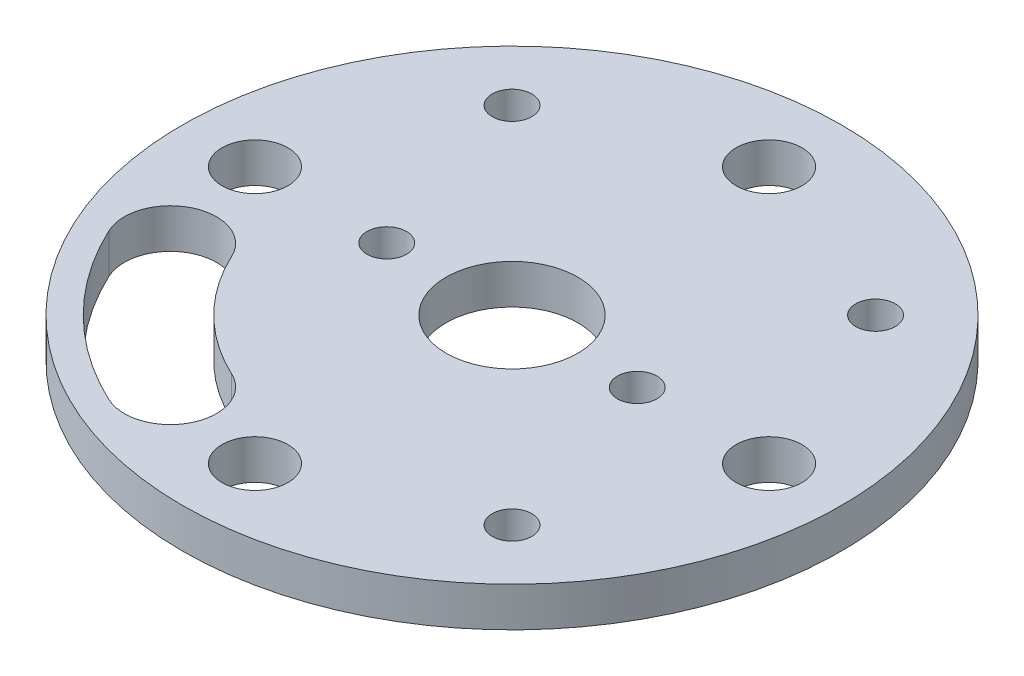
ISO-10303-21;
HEADER;
FILE_DESCRIPTION(('STEP AP214'),'2;1');
FILE_NAME('part.step','',(''),(''),'','','');
FILE_SCHEMA(('AUTOMOTIVE_DESIGN { 1 0 10303 214 1 1 1 1 }'));
ENDSEC;
DATA;
#1=APPLICATION_CONTEXT('core data for automotive mechanical design processes');
#2=APPLICATION_PROTOCOL_DEFINITION('international standard','automotive_design',2000,#1);
#3=PRODUCT_CONTEXT('',#1,'mechanical');
#4=PRODUCT('Part','Part','',(#3));
#5=PRODUCT_RELATED_PRODUCT_CATEGORY('part','',(#4));
#6=PRODUCT_DEFINITION_FORMATION('','',#4);
#7=PRODUCT_DEFINITION_CONTEXT('part definition',#1,'design');
#8=PRODUCT_DEFINITION('design','',#6,#7);
#9=PRODUCT_DEFINITION_SHAPE('','',#8);
#10=(LENGTH_UNIT() NAMED_UNIT(*) SI_UNIT(.MILLI.,.METRE.));
#11=(NAMED_UNIT(*) PLANE_ANGLE_UNIT() SI_UNIT($,.RADIAN.));
#12=(NAMED_UNIT(*) SI_UNIT($,.STERADIAN.) SOLID_ANGLE_UNIT());
#13=UNCERTAINTY_MEASURE_WITH_UNIT(LENGTH_MEASURE(1.E-05),#10,'distance_accuracy_value','');
#14=(GEOMETRIC_REPRESENTATION_CONTEXT(3) GLOBAL_UNCERTAINTY_ASSIGNED_CONTEXT((#13)) GLOBAL_UNIT_ASSIGNED_CONTEXT((#10,
#11,#12)) REPRESENTATION_CONTEXT('',''));
#15=CARTESIAN_POINT('',(0.,0.,0.));
#16=DIRECTION('',(0.,0.,1.));
#17=DIRECTION('',(1.,0.,0.));
#18=AXIS2_PLACEMENT_3D('',#15,#16,#17);
#19=CARTESIAN_POINT('',(0.,3.,0.));
#20=DIRECTION('',(0.,1.,0.));
#21=DIRECTION('',(0.,0.,1.));
#22=AXIS2_PLACEMENT_3D('',#19,#20,#21);
#23=PLANE('',#22);
#24=CARTESIAN_POINT('',(13.7885822331377,3.,-13.7885822331377));
#25=DIRECTION('',(0.,1.,0.));
#26=DIRECTION('',(0.,0.,1.));
#27=AXIS2_PLACEMENT_3D('',#24,#25,#26);
#28=CIRCLE('',#27,1.5);
#29=CARTESIAN_POINT('',(13.7885822331377,3.,-12.2885822331377));
#30=VERTEX_POINT('',#29);
#31=EDGE_CURVE('E179',#30,#30,#28,.T.);
#32=ORIENTED_EDGE('',*,*,#31,.F.);
#33=EDGE_LOOP('',(#32));
#34=FACE_BOUND('',#33,.T.);
#35=CARTESIAN_POINT('',(0.,3.,0.));
#36=DIRECTION('',(0.,1.,0.));
#37=DIRECTION('',(0.,0.,1.));
#38=AXIS2_PLACEMENT_3D('',#35,#36,#37);
#39=CIRCLE('',#38,23.);
#40=CARTESIAN_POINT('',(-20.8450791018429,3.,9.72022002003619));
#41=VERTEX_POINT('',#40);
#42=CARTESIAN_POINT('',(-9.72022002003597,3.,20.845079101843));
#43=VERTEX_POINT('',#42);
#44=EDGE_CURVE('E81',#41,#43,#39,.T.);
#45=ORIENTED_EDGE('',*,*,#44,.F.);
#46=CARTESIAN_POINT('',(-17.6730018472146,3.,8.24105610394372));
#47=DIRECTION('',(0.,1.,0.));
#48=DIRECTION('',(0.,0.,-1.));
#49=AXIS2_PLACEMENT_3D('',#46,#47,#48);
#50=CIRCLE('',#49,3.50000000000001);
#51=CARTESIAN_POINT('',(-14.5009245925864,3.,6.76189218785126));
#52=VERTEX_POINT('',#51);
#53=EDGE_CURVE('E73',#52,#41,#50,.T.);
#54=ORIENTED_EDGE('',*,*,#53,.F.);
#55=CARTESIAN_POINT('',(0.,3.,0.));
#56=DIRECTION('',(0.,-1.,0.));
#57=DIRECTION('',(0.,0.,1.));
#58=AXIS2_PLACEMENT_3D('',#55,#56,#57);
#59=CIRCLE('',#58,16.);
#60=CARTESIAN_POINT('',(-6.76189218785111,3.,14.5009245925864));
#61=VERTEX_POINT('',#60);
#62=EDGE_CURVE('E96',#61,#52,#59,.T.);
#63=ORIENTED_EDGE('',*,*,#62,.F.);
#64=CARTESIAN_POINT('',(-8.24105610394353,3.,17.6730018472147));
#65=DIRECTION('',(0.,1.,0.));
#66=DIRECTION('',(0.,0.,-1.));
#67=AXIS2_PLACEMENT_3D('',#64,#65,#66);
#68=CIRCLE('',#67,3.50000000000001);
#69=EDGE_CURVE('E94',#43,#61,#68,.T.);
#70=ORIENTED_EDGE('',*,*,#69,.F.);
#71=EDGE_LOOP('',(#45,#54,#63,#70));
#72=FACE_BOUND('',#71,.T.);
#73=CARTESIAN_POINT('',(0.,3.,19.5));
#74=DIRECTION('',(0.,1.,0.));
#75=DIRECTION('',(0.,0.,1.));
#76=AXIS2_PLACEMENT_3D('',#73,#74,#75);
#77=CIRCLE('',#76,2.5);
#78=CARTESIAN_POINT('',(0.,3.,22.));
#79=VERTEX_POINT('',#78);
#80=EDGE_CURVE('E118',#79,#79,#77,.T.);
#81=ORIENTED_EDGE('',*,*,#80,.F.);
#82=EDGE_LOOP('',(#81));
#83=FACE_BOUND('',#82,.T.);
#84=CARTESIAN_POINT('',(0.,3.,-19.5));
#85=DIRECTION('',(0.,1.,0.));
#86=DIRECTION('',(0.,0.,1.));
#87=AXIS2_PLACEMENT_3D('',#84,#85,#86);
#88=CIRCLE('',#87,2.5);
#89=CARTESIAN_POINT('',(0.,3.,-17.));
#90=VERTEX_POINT('',#89);
#91=EDGE_CURVE('E130',#90,#90,#88,.T.);
#92=ORIENTED_EDGE('',*,*,#91,.F.);
#93=EDGE_LOOP('',(#92));
#94=FACE_BOUND('',#93,.T.);
#95=CARTESIAN_POINT('',(-9.5,3.,0.));
#96=DIRECTION('',(0.,1.,0.));
#97=DIRECTION('',(0.,0.,1.));
#98=AXIS2_PLACEMENT_3D('',#95,#96,#97);
#99=CIRCLE('',#98,1.5);
#100=CARTESIAN_POINT('',(-9.5,3.,1.5));
#101=VERTEX_POINT('',#100);
#102=EDGE_CURVE('E142',#101,#101,#99,.T.);
#103=ORIENTED_EDGE('',*,*,#102,.F.);
#104=EDGE_LOOP('',(#103));
#105=FACE_BOUND('',#104,.T.);
#106=CARTESIAN_POINT('',(0.,3.,0.));
#107=DIRECTION('',(0.,1.,0.));
#108=DIRECTION('',(0.,0.,1.));
#109=AXIS2_PLACEMENT_3D('',#106,#107,#108);
#110=CIRCLE('',#109,25.);
#111=CARTESIAN_POINT('',(0.,3.,25.));
#112=VERTEX_POINT('',#111);
#113=EDGE_CURVE('E11',#112,#112,#110,.T.);
#114=ORIENTED_EDGE('',*,*,#113,.T.);
#115=EDGE_LOOP('',(#114));
#116=FACE_BOUND('',#115,.T.);
#117=CARTESIAN_POINT('',(0.,3.,0.));
#118=DIRECTION('',(0.,1.,0.));
#119=DIRECTION('',(0.,0.,1.));
#120=AXIS2_PLACEMENT_3D('',#117,#118,#119);
#121=CIRCLE('',#120,5.);
#122=CARTESIAN_POINT('',(0.,3.,5.));
#123=VERTEX_POINT('',#122);
#124=EDGE_CURVE('E148',#123,#123,#121,.T.);
#125=ORIENTED_EDGE('',*,*,#124,.F.);
#126=EDGE_LOOP('',(#125));
#127=FACE_BOUND('',#126,.T.);
#128=CARTESIAN_POINT('',(9.5,3.,0.));
#129=DIRECTION('',(0.,1.,0.));
#130=DIRECTION('',(0.,0.,1.));
#131=AXIS2_PLACEMENT_3D('',#128,#129,#130);
#132=CIRCLE('',#131,1.5);
#133=CARTESIAN_POINT('',(9.5,3.,1.5));
#134=VERTEX_POINT('',#133);
#135=EDGE_CURVE('E136',#134,#134,#132,.T.);
#136=ORIENTED_EDGE('',*,*,#135,.F.);
#137=EDGE_LOOP('',(#136));
#138=FACE_BOUND('',#137,.T.);
#139=CARTESIAN_POINT('',(19.5,3.,0.));
#140=DIRECTION('',(0.,1.,0.));
#141=DIRECTION('',(0.,0.,1.));
#142=AXIS2_PLACEMENT_3D('',#139,#140,#141);
#143=CIRCLE('',#142,2.5);
#144=CARTESIAN_POINT('',(19.5,3.,2.5));
#145=VERTEX_POINT('',#144);
#146=EDGE_CURVE('E124',#145,#145,#143,.T.);
#147=ORIENTED_EDGE('',*,*,#146,.F.);
#148=EDGE_LOOP('',(#147));
#149=FACE_BOUND('',#148,.T.);
#150=CARTESIAN_POINT('',(-19.5,3.,0.));
#151=DIRECTION('',(0.,1.,0.));
#152=DIRECTION('',(0.,0.,1.));
#153=AXIS2_PLACEMENT_3D('',#150,#151,#152);
#154=CIRCLE('',#153,2.5);
#155=CARTESIAN_POINT('',(-19.5,3.,2.5));
#156=VERTEX_POINT('',#155);
#157=EDGE_CURVE('E112',#156,#156,#154,.T.);
#158=ORIENTED_EDGE('',*,*,#157,.F.);
#159=EDGE_LOOP('',(#158));
#160=FACE_BOUND('',#159,.T.);
#161=CARTESIAN_POINT('',(-13.7885822331377,3.,-13.7885822331376));
#162=DIRECTION('',(0.,1.,0.));
#163=DIRECTION('',(0.,0.,1.));
#164=AXIS2_PLACEMENT_3D('',#161,#162,#163);
#165=CIRCLE('',#164,1.5);
#166=CARTESIAN_POINT('',(-13.7885822331377,3.,-12.2885822331376));
#167=VERTEX_POINT('',#166);
#168=EDGE_CURVE('E102',#167,#167,#165,.T.);
#169=ORIENTED_EDGE('',*,*,#168,.F.);
#170=EDGE_LOOP('',(#169));
#171=FACE_BOUND('',#170,.T.);
#172=CARTESIAN_POINT('',(13.7885822331377,3.,13.7885822331377));
#173=DIRECTION('',(0.,1.,0.));
#174=DIRECTION('',(0.,0.,1.));
#175=AXIS2_PLACEMENT_3D('',#172,#173,#174);
#176=CIRCLE('',#175,1.5);
#177=CARTESIAN_POINT('',(13.7885822331377,3.,15.2885822331377));
#178=VERTEX_POINT('',#177);
#179=EDGE_CURVE('E186',#178,#178,#176,.T.);
#180=ORIENTED_EDGE('',*,*,#179,.F.);
#181=EDGE_LOOP('',(#180));
#182=FACE_BOUND('',#181,.T.);
#183=ADVANCED_FACE('F32',(#34,#72,#83,#94,#105,#116,#127,#138,#149,#160,#171,#182),#23,.T.);
#184=CARTESIAN_POINT('',(0.,0.,0.));
#185=DIRECTION('',(0.,1.,0.));
#186=DIRECTION('',(0.,0.,1.));
#187=AXIS2_PLACEMENT_3D('',#184,#185,#186);
#188=PLANE('',#187);
#189=CARTESIAN_POINT('',(13.7885822331377,0.,-13.7885822331377));
#190=DIRECTION('',(0.,1.,0.));
#191=DIRECTION('',(0.,0.,1.));
#192=AXIS2_PLACEMENT_3D('',#189,#190,#191);
#193=CIRCLE('',#192,1.5);
#194=CARTESIAN_POINT('',(13.7885822331377,0.,-12.2885822331377));
#195=VERTEX_POINT('',#194);
#196=EDGE_CURVE('E182',#195,#195,#193,.T.);
#197=ORIENTED_EDGE('',*,*,#196,.T.);
#198=EDGE_LOOP('',(#197));
#199=FACE_BOUND('',#198,.T.);
#200=CARTESIAN_POINT('',(-17.6730018472146,0.,8.24105610394372));
#201=DIRECTION('',(0.,1.,0.));
#202=DIRECTION('',(0.,0.,-1.));
#203=AXIS2_PLACEMENT_3D('',#200,#201,#202);
#204=CIRCLE('',#203,3.50000000000001);
#205=CARTESIAN_POINT('',(-14.5009245925864,0.,6.76189218785126));
#206=VERTEX_POINT('',#205);
#207=CARTESIAN_POINT('',(-20.8450791018429,0.,9.72022002003619));
#208=VERTEX_POINT('',#207);
#209=EDGE_CURVE('E55',#206,#208,#204,.T.);
#210=ORIENTED_EDGE('',*,*,#209,.T.);
#211=CARTESIAN_POINT('',(0.,0.,0.));
#212=DIRECTION('',(0.,1.,0.));
#213=DIRECTION('',(0.,0.,1.));
#214=AXIS2_PLACEMENT_3D('',#211,#212,#213);
#215=CIRCLE('',#214,23.);
#216=CARTESIAN_POINT('',(-9.72022002003597,0.,20.845079101843));
#217=VERTEX_POINT('',#216);
#218=EDGE_CURVE('E88',#208,#217,#215,.T.);
#219=ORIENTED_EDGE('',*,*,#218,.T.);
#220=CARTESIAN_POINT('',(-8.24105610394353,0.,17.6730018472147));
#221=DIRECTION('',(0.,1.,0.));
#222=DIRECTION('',(0.,0.,-1.));
#223=AXIS2_PLACEMENT_3D('',#220,#221,#222);
#224=CIRCLE('',#223,3.50000000000001);
#225=CARTESIAN_POINT('',(-6.76189218785111,0.,14.5009245925864));
#226=VERTEX_POINT('',#225);
#227=EDGE_CURVE('E104',#217,#226,#224,.T.);
#228=ORIENTED_EDGE('',*,*,#227,.T.);
#229=CARTESIAN_POINT('',(0.,0.,0.));
#230=DIRECTION('',(0.,-1.,0.));
#231=DIRECTION('',(0.,0.,1.));
#232=AXIS2_PLACEMENT_3D('',#229,#230,#231);
#233=CIRCLE('',#232,16.);
#234=EDGE_CURVE('E82',#226,#206,#233,.T.);
#235=ORIENTED_EDGE('',*,*,#234,.T.);
#236=EDGE_LOOP('',(#210,#219,#228,#235));
#237=FACE_BOUND('',#236,.T.);
#238=CARTESIAN_POINT('',(0.,0.,19.5));
#239=DIRECTION('',(0.,1.,0.));
#240=DIRECTION('',(0.,0.,1.));
#241=AXIS2_PLACEMENT_3D('',#238,#239,#240);
#242=CIRCLE('',#241,2.5);
#243=CARTESIAN_POINT('',(0.,0.,22.));
#244=VERTEX_POINT('',#243);
#245=EDGE_CURVE('E115',#244,#244,#242,.T.);
#246=ORIENTED_EDGE('',*,*,#245,.T.);
#247=EDGE_LOOP('',(#246));
#248=FACE_BOUND('',#247,.T.);
#249=CARTESIAN_POINT('',(0.,0.,-19.5));
#250=DIRECTION('',(0.,1.,0.));
#251=DIRECTION('',(0.,0.,1.));
#252=AXIS2_PLACEMENT_3D('',#249,#250,#251);
#253=CIRCLE('',#252,2.5);
#254=CARTESIAN_POINT('',(0.,0.,-17.));
#255=VERTEX_POINT('',#254);
#256=EDGE_CURVE('E127',#255,#255,#253,.T.);
#257=ORIENTED_EDGE('',*,*,#256,.T.);
#258=EDGE_LOOP('',(#257));
#259=FACE_BOUND('',#258,.T.);
#260=CARTESIAN_POINT('',(-9.5,0.,0.));
#261=DIRECTION('',(0.,1.,0.));
#262=DIRECTION('',(0.,0.,1.));
#263=AXIS2_PLACEMENT_3D('',#260,#261,#262);
#264=CIRCLE('',#263,1.5);
#265=CARTESIAN_POINT('',(-9.5,0.,1.5));
#266=VERTEX_POINT('',#265);
#267=EDGE_CURVE('E139',#266,#266,#264,.T.);
#268=ORIENTED_EDGE('',*,*,#267,.T.);
#269=EDGE_LOOP('',(#268));
#270=FACE_BOUND('',#269,.T.);
#271=CARTESIAN_POINT('',(0.,0.,0.));
#272=DIRECTION('',(0.,1.,0.));
#273=DIRECTION('',(0.,0.,1.));
#274=AXIS2_PLACEMENT_3D('',#271,#272,#273);
#275=CIRCLE('',#274,25.);
#276=CARTESIAN_POINT('',(0.,0.,25.));
#277=VERTEX_POINT('',#276);
#278=EDGE_CURVE('E36',#277,#277,#275,.T.);
#279=ORIENTED_EDGE('',*,*,#278,.F.);
#280=EDGE_LOOP('',(#279));
#281=FACE_BOUND('',#280,.T.);
#282=CARTESIAN_POINT('',(0.,0.,0.));
#283=DIRECTION('',(0.,1.,0.));
#284=DIRECTION('',(0.,0.,1.));
#285=AXIS2_PLACEMENT_3D('',#282,#283,#284);
#286=CIRCLE('',#285,5.);
#287=CARTESIAN_POINT('',(0.,0.,5.));
#288=VERTEX_POINT('',#287);
#289=EDGE_CURVE('E145',#288,#288,#286,.T.);
#290=ORIENTED_EDGE('',*,*,#289,.T.);
#291=EDGE_LOOP('',(#290));
#292=FACE_BOUND('',#291,.T.);
#293=CARTESIAN_POINT('',(9.5,0.,0.));
#294=DIRECTION('',(0.,1.,0.));
#295=DIRECTION('',(0.,0.,1.));
#296=AXIS2_PLACEMENT_3D('',#293,#294,#295);
#297=CIRCLE('',#296,1.5);
#298=CARTESIAN_POINT('',(9.5,0.,1.5));
#299=VERTEX_POINT('',#298);
#300=EDGE_CURVE('E133',#299,#299,#297,.T.);
#301=ORIENTED_EDGE('',*,*,#300,.T.);
#302=EDGE_LOOP('',(#301));
#303=FACE_BOUND('',#302,.T.);
#304=CARTESIAN_POINT('',(19.5,0.,0.));
#305=DIRECTION('',(0.,1.,0.));
#306=DIRECTION('',(0.,0.,1.));
#307=AXIS2_PLACEMENT_3D('',#304,#305,#306);
#308=CIRCLE('',#307,2.5);
#309=CARTESIAN_POINT('',(19.5,0.,2.5));
#310=VERTEX_POINT('',#309);
#311=EDGE_CURVE('E121',#310,#310,#308,.T.);
#312=ORIENTED_EDGE('',*,*,#311,.T.);
#313=EDGE_LOOP('',(#312));
#314=FACE_BOUND('',#313,.T.);
#315=CARTESIAN_POINT('',(-19.5,0.,0.));
#316=DIRECTION('',(0.,1.,0.));
#317=DIRECTION('',(0.,0.,1.));
#318=AXIS2_PLACEMENT_3D('',#315,#316,#317);
#319=CIRCLE('',#318,2.5);
#320=CARTESIAN_POINT('',(-19.5,0.,2.5));
#321=VERTEX_POINT('',#320);
#322=EDGE_CURVE('E89',#321,#321,#319,.T.);
#323=ORIENTED_EDGE('',*,*,#322,.T.);
#324=EDGE_LOOP('',(#323));
#325=FACE_BOUND('',#324,.T.);
#326=CARTESIAN_POINT('',(-13.7885822331377,0.,-13.7885822331376));
#327=DIRECTION('',(0.,1.,0.));
#328=DIRECTION('',(0.,0.,1.));
#329=AXIS2_PLACEMENT_3D('',#326,#327,#328);
#330=CIRCLE('',#329,1.5);
#331=CARTESIAN_POINT('',(-13.7885822331377,0.,-12.2885822331376));
#332=VERTEX_POINT('',#331);
#333=EDGE_CURVE('E181',#332,#332,#330,.T.);
#334=ORIENTED_EDGE('',*,*,#333,.T.);
#335=EDGE_LOOP('',(#334));
#336=FACE_BOUND('',#335,.T.);
#337=CARTESIAN_POINT('',(13.7885822331377,0.,13.7885822331377));
#338=DIRECTION('',(0.,1.,0.));
#339=DIRECTION('',(0.,0.,1.));
#340=AXIS2_PLACEMENT_3D('',#337,#338,#339);
#341=CIRCLE('',#340,1.5);
#342=CARTESIAN_POINT('',(13.7885822331377,0.,15.2885822331377));
#343=VERTEX_POINT('',#342);
#344=EDGE_CURVE('E189',#343,#343,#341,.T.);
#345=ORIENTED_EDGE('',*,*,#344,.T.);
#346=EDGE_LOOP('',(#345));
#347=FACE_BOUND('',#346,.T.);
#348=ADVANCED_FACE('F154',(#199,#237,#248,#259,#270,#281,#292,#303,#314,#325,#336,#347),#188,.F.);
#349=CARTESIAN_POINT('',(0.,3.,0.));
#350=DIRECTION('',(0.,-1.,0.));
#351=DIRECTION('',(0.,0.,-1.));
#352=AXIS2_PLACEMENT_3D('',#349,#350,#351);
#353=CYLINDRICAL_SURFACE('',#352,25.);
#354=ORIENTED_EDGE('',*,*,#113,.F.);
#355=EDGE_LOOP('',(#354));
#356=FACE_BOUND('',#355,.T.);
#357=ORIENTED_EDGE('',*,*,#278,.T.);
#358=EDGE_LOOP('',(#357));
#359=FACE_BOUND('',#358,.T.);
#360=ADVANCED_FACE('F34',(#356,#359),#353,.T.);
#361=CARTESIAN_POINT('',(0.,3.,0.));
#362=DIRECTION('',(0.,-1.,0.));
#363=DIRECTION('',(0.,0.,-1.));
#364=AXIS2_PLACEMENT_3D('',#361,#362,#363);
#365=CYLINDRICAL_SURFACE('',#364,5.);
#366=ORIENTED_EDGE('',*,*,#124,.T.);
#367=EDGE_LOOP('',(#366));
#368=FACE_BOUND('',#367,.T.);
#369=ORIENTED_EDGE('',*,*,#289,.F.);
#370=EDGE_LOOP('',(#369));
#371=FACE_BOUND('',#370,.T.);
#372=ADVANCED_FACE('F157',(#368,#371),#365,.F.);
#373=CARTESIAN_POINT('',(-9.5,3.,0.));
#374=DIRECTION('',(0.,-1.,0.));
#375=DIRECTION('',(0.,0.,-1.));
#376=AXIS2_PLACEMENT_3D('',#373,#374,#375);
#377=CYLINDRICAL_SURFACE('',#376,1.5);
#378=ORIENTED_EDGE('',*,*,#102,.T.);
#379=EDGE_LOOP('',(#378));
#380=FACE_BOUND('',#379,.T.);
#381=ORIENTED_EDGE('',*,*,#267,.F.);
#382=EDGE_LOOP('',(#381));
#383=FACE_BOUND('',#382,.T.);
#384=ADVANCED_FACE('F159',(#380,#383),#377,.F.);
#385=CARTESIAN_POINT('',(9.5,3.,0.));
#386=DIRECTION('',(0.,-1.,0.));
#387=DIRECTION('',(0.,0.,-1.));
#388=AXIS2_PLACEMENT_3D('',#385,#386,#387);
#389=CYLINDRICAL_SURFACE('',#388,1.5);
#390=ORIENTED_EDGE('',*,*,#135,.T.);
#391=EDGE_LOOP('',(#390));
#392=FACE_BOUND('',#391,.T.);
#393=ORIENTED_EDGE('',*,*,#300,.F.);
#394=EDGE_LOOP('',(#393));
#395=FACE_BOUND('',#394,.T.);
#396=ADVANCED_FACE('F166',(#392,#395),#389,.F.);
#397=CARTESIAN_POINT('',(0.,3.,-19.5));
#398=DIRECTION('',(0.,-1.,0.));
#399=DIRECTION('',(0.,0.,-1.));
#400=AXIS2_PLACEMENT_3D('',#397,#398,#399);
#401=CYLINDRICAL_SURFACE('',#400,2.5);
#402=ORIENTED_EDGE('',*,*,#91,.T.);
#403=EDGE_LOOP('',(#402));
#404=FACE_BOUND('',#403,.T.);
#405=ORIENTED_EDGE('',*,*,#256,.F.);
#406=EDGE_LOOP('',(#405));
#407=FACE_BOUND('',#406,.T.);
#408=ADVANCED_FACE('F239',(#404,#407),#401,.F.);
#409=CARTESIAN_POINT('',(19.5,3.,0.));
#410=DIRECTION('',(0.,-1.,0.));
#411=DIRECTION('',(0.,0.,-1.));
#412=AXIS2_PLACEMENT_3D('',#409,#410,#411);
#413=CYLINDRICAL_SURFACE('',#412,2.5);
#414=ORIENTED_EDGE('',*,*,#146,.T.);
#415=EDGE_LOOP('',(#414));
#416=FACE_BOUND('',#415,.T.);
#417=ORIENTED_EDGE('',*,*,#311,.F.);
#418=EDGE_LOOP('',(#417));
#419=FACE_BOUND('',#418,.T.);
#420=ADVANCED_FACE('F235',(#416,#419),#413,.F.);
#421=CARTESIAN_POINT('',(0.,3.,19.5));
#422=DIRECTION('',(0.,-1.,0.));
#423=DIRECTION('',(0.,0.,-1.));
#424=AXIS2_PLACEMENT_3D('',#421,#422,#423);
#425=CYLINDRICAL_SURFACE('',#424,2.5);
#426=ORIENTED_EDGE('',*,*,#80,.T.);
#427=EDGE_LOOP('',(#426));
#428=FACE_BOUND('',#427,.T.);
#429=ORIENTED_EDGE('',*,*,#245,.F.);
#430=EDGE_LOOP('',(#429));
#431=FACE_BOUND('',#430,.T.);
#432=ADVANCED_FACE('F231',(#428,#431),#425,.F.);
#433=CARTESIAN_POINT('',(-19.5,3.,0.));
#434=DIRECTION('',(0.,-1.,0.));
#435=DIRECTION('',(0.,0.,-1.));
#436=AXIS2_PLACEMENT_3D('',#433,#434,#435);
#437=CYLINDRICAL_SURFACE('',#436,2.5);
#438=ORIENTED_EDGE('',*,*,#157,.T.);
#439=EDGE_LOOP('',(#438));
#440=FACE_BOUND('',#439,.T.);
#441=ORIENTED_EDGE('',*,*,#322,.F.);
#442=EDGE_LOOP('',(#441));
#443=FACE_BOUND('',#442,.T.);
#444=ADVANCED_FACE('F228',(#440,#443),#437,.F.);
#445=CARTESIAN_POINT('',(-17.6730018472146,3.,8.24105610394372));
#446=DIRECTION('',(0.,-1.,0.));
#447=DIRECTION('',(0.,0.,-1.));
#448=AXIS2_PLACEMENT_3D('',#445,#446,#447);
#449=CYLINDRICAL_SURFACE('',#448,3.50000000000001);
#450=ORIENTED_EDGE('',*,*,#209,.F.);
#451=DIRECTION('',(0.,-1.,0.));
#452=VECTOR('',#451,1.);
#453=CARTESIAN_POINT('',(-14.5009245925864,3.,6.76189218785126));
#454=LINE('',#453,#452);
#455=EDGE_CURVE('E77',#52,#206,#454,.T.);
#456=ORIENTED_EDGE('',*,*,#455,.F.);
#457=ORIENTED_EDGE('',*,*,#53,.T.);
#458=DIRECTION('',(0.,-1.,0.));
#459=VECTOR('',#458,1.);
#460=CARTESIAN_POINT('',(-20.8450791018429,3.,9.72022002003619));
#461=LINE('',#460,#459);
#462=EDGE_CURVE('E76',#41,#208,#461,.T.);
#463=ORIENTED_EDGE('',*,*,#462,.T.);
#464=EDGE_LOOP('',(#450,#456,#457,#463));
#465=FACE_BOUND('',#464,.T.);
#466=ADVANCED_FACE('F75',(#465),#449,.F.);
#467=CARTESIAN_POINT('',(0.,3.,0.));
#468=DIRECTION('',(0.,-1.,0.));
#469=DIRECTION('',(0.,0.,-1.));
#470=AXIS2_PLACEMENT_3D('',#467,#468,#469);
#471=CYLINDRICAL_SURFACE('',#470,23.);
#472=ORIENTED_EDGE('',*,*,#218,.F.);
#473=ORIENTED_EDGE('',*,*,#462,.F.);
#474=ORIENTED_EDGE('',*,*,#44,.T.);
#475=DIRECTION('',(0.,-1.,0.));
#476=VECTOR('',#475,1.);
#477=CARTESIAN_POINT('',(-9.72022002003597,3.,20.845079101843));
#478=LINE('',#477,#476);
#479=EDGE_CURVE('E90',#43,#217,#478,.T.);
#480=ORIENTED_EDGE('',*,*,#479,.T.);
#481=EDGE_LOOP('',(#472,#473,#474,#480));
#482=FACE_BOUND('',#481,.T.);
#483=ADVANCED_FACE('F85',(#482),#471,.F.);
#484=CARTESIAN_POINT('',(-8.24105610394353,3.,17.6730018472147));
#485=DIRECTION('',(0.,-1.,0.));
#486=DIRECTION('',(0.,0.,-1.));
#487=AXIS2_PLACEMENT_3D('',#484,#485,#486);
#488=CYLINDRICAL_SURFACE('',#487,3.50000000000001);
#489=ORIENTED_EDGE('',*,*,#227,.F.);
#490=ORIENTED_EDGE('',*,*,#479,.F.);
#491=ORIENTED_EDGE('',*,*,#69,.T.);
#492=DIRECTION('',(0.,-1.,0.));
#493=VECTOR('',#492,1.);
#494=CARTESIAN_POINT('',(-6.76189218785111,3.,14.5009245925864));
#495=LINE('',#494,#493);
#496=EDGE_CURVE('E47',#61,#226,#495,.T.);
#497=ORIENTED_EDGE('',*,*,#496,.T.);
#498=EDGE_LOOP('',(#489,#490,#491,#497));
#499=FACE_BOUND('',#498,.T.);
#500=ADVANCED_FACE('F220',(#499),#488,.F.);
#501=CARTESIAN_POINT('',(0.,3.,0.));
#502=DIRECTION('',(0.,-1.,0.));
#503=DIRECTION('',(0.,0.,-1.));
#504=AXIS2_PLACEMENT_3D('',#501,#502,#503);
#505=CYLINDRICAL_SURFACE('',#504,16.);
#506=ORIENTED_EDGE('',*,*,#234,.F.);
#507=ORIENTED_EDGE('',*,*,#496,.F.);
#508=ORIENTED_EDGE('',*,*,#62,.T.);
#509=ORIENTED_EDGE('',*,*,#455,.T.);
#510=EDGE_LOOP('',(#506,#507,#508,#509));
#511=FACE_BOUND('',#510,.T.);
#512=ADVANCED_FACE('F217',(#511),#505,.T.);
#513=CARTESIAN_POINT('',(-13.7885822331377,3.,-13.7885822331376));
#514=DIRECTION('',(0.,-1.,0.));
#515=DIRECTION('',(0.,0.,-1.));
#516=AXIS2_PLACEMENT_3D('',#513,#514,#515);
#517=CYLINDRICAL_SURFACE('',#516,1.5);
#518=ORIENTED_EDGE('',*,*,#168,.T.);
#519=EDGE_LOOP('',(#518));
#520=FACE_BOUND('',#519,.T.);
#521=ORIENTED_EDGE('',*,*,#333,.F.);
#522=EDGE_LOOP('',(#521));
#523=FACE_BOUND('',#522,.T.);
#524=ADVANCED_FACE('F195',(#520,#523),#517,.F.);
#525=CARTESIAN_POINT('',(13.7885822331377,3.,-13.7885822331377));
#526=DIRECTION('',(0.,-1.,0.));
#527=DIRECTION('',(0.,0.,-1.));
#528=AXIS2_PLACEMENT_3D('',#525,#526,#527);
#529=CYLINDRICAL_SURFACE('',#528,1.5);
#530=ORIENTED_EDGE('',*,*,#31,.T.);
#531=EDGE_LOOP('',(#530));
#532=FACE_BOUND('',#531,.T.);
#533=ORIENTED_EDGE('',*,*,#196,.F.);
#534=EDGE_LOOP('',(#533));
#535=FACE_BOUND('',#534,.T.);
#536=ADVANCED_FACE('F208',(#532,#535),#529,.F.);
#537=CARTESIAN_POINT('',(13.7885822331377,3.,13.7885822331377));
#538=DIRECTION('',(0.,-1.,0.));
#539=DIRECTION('',(0.,0.,-1.));
#540=AXIS2_PLACEMENT_3D('',#537,#538,#539);
#541=CYLINDRICAL_SURFACE('',#540,1.5);
#542=ORIENTED_EDGE('',*,*,#179,.T.);
#543=EDGE_LOOP('',(#542));
#544=FACE_BOUND('',#543,.T.);
#545=ORIENTED_EDGE('',*,*,#344,.F.);
#546=EDGE_LOOP('',(#545));
#547=FACE_BOUND('',#546,.T.);
#548=ADVANCED_FACE('F206',(#544,#547),#541,.F.);
#549=CLOSED_SHELL('',(#183,#348,#360,#372,#384,#396,#408,#420,#432,#444,#466,#483,#500,#512,
#524,#536,#548));
#550=MANIFOLD_SOLID_BREP('B2',#549);
#551=ADVANCED_BREP_SHAPE_REPRESENTATION('',(#18,#550),#14);
#552=SHAPE_DEFINITION_REPRESENTATION(#9,#551);
ENDSEC;
END-ISO-10303-21;
